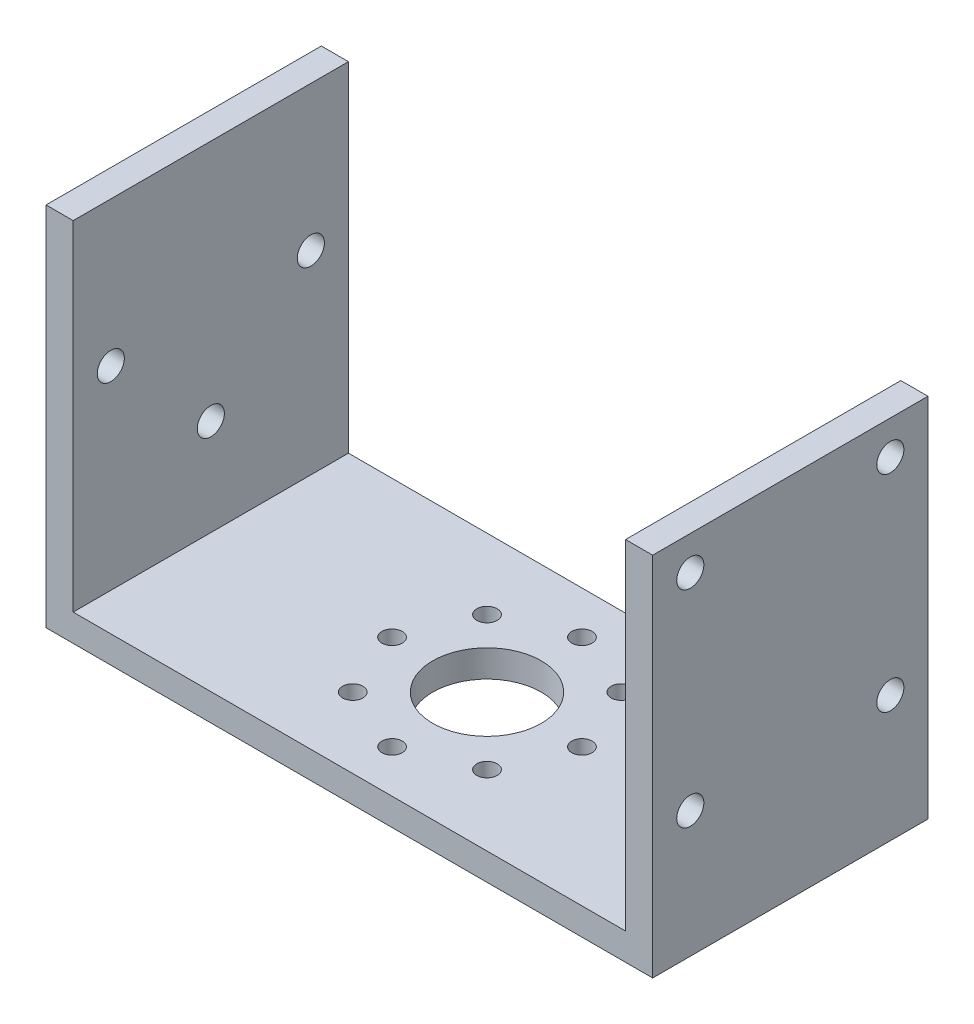
ISO-10303-21;
HEADER;
FILE_DESCRIPTION(('STEP AP214'),'2;1');
FILE_NAME('part.step','',(''),(''),'','','');
FILE_SCHEMA(('AUTOMOTIVE_DESIGN { 1 0 10303 214 1 1 1 1 }'));
ENDSEC;
DATA;
#1=APPLICATION_CONTEXT('core data for automotive mechanical design processes');
#2=APPLICATION_PROTOCOL_DEFINITION('international standard','automotive_design',2000,#1);
#3=PRODUCT_CONTEXT('',#1,'mechanical');
#4=PRODUCT('Part','Part','',(#3));
#5=PRODUCT_RELATED_PRODUCT_CATEGORY('part','',(#4));
#6=PRODUCT_DEFINITION_FORMATION('','',#4);
#7=PRODUCT_DEFINITION_CONTEXT('part definition',#1,'design');
#8=PRODUCT_DEFINITION('design','',#6,#7);
#9=PRODUCT_DEFINITION_SHAPE('','',#8);
#10=(LENGTH_UNIT() NAMED_UNIT(*) SI_UNIT(.MILLI.,.METRE.));
#11=(NAMED_UNIT(*) PLANE_ANGLE_UNIT() SI_UNIT($,.RADIAN.));
#12=(NAMED_UNIT(*) SI_UNIT($,.STERADIAN.) SOLID_ANGLE_UNIT());
#13=UNCERTAINTY_MEASURE_WITH_UNIT(LENGTH_MEASURE(1.E-05),#10,'distance_accuracy_value','');
#14=(GEOMETRIC_REPRESENTATION_CONTEXT(3) GLOBAL_UNCERTAINTY_ASSIGNED_CONTEXT((#13)) GLOBAL_UNIT_ASSIGNED_CONTEXT((#10,
#11,#12)) REPRESENTATION_CONTEXT('',''));
#15=CARTESIAN_POINT('',(0.,0.,0.));
#16=DIRECTION('',(0.,0.,1.));
#17=DIRECTION('',(1.,0.,0.));
#18=AXIS2_PLACEMENT_3D('',#15,#16,#17);
#19=CARTESIAN_POINT('',(0.,2.,0.));
#20=DIRECTION('',(0.,-1.,0.));
#21=DIRECTION('',(0.,0.,-1.));
#22=AXIS2_PLACEMENT_3D('',#19,#20,#21);
#23=PLANE('',#22);
#24=CARTESIAN_POINT('',(15.365,2.,-10.15));
#25=DIRECTION('',(0.,-1.,0.));
#26=DIRECTION('',(0.,0.,-1.));
#27=AXIS2_PLACEMENT_3D('',#24,#25,#26);
#28=CIRCLE('',#27,0.750000000000002);
#29=CARTESIAN_POINT('',(15.365,2.,-10.9));
#30=VERTEX_POINT('',#29);
#31=EDGE_CURVE('E490',#30,#30,#28,.F.);
#32=ORIENTED_EDGE('',*,*,#31,.F.);
#33=EDGE_LOOP('',(#32));
#34=FACE_BOUND('',#33,.T.);
#35=CARTESIAN_POINT('',(17.4152525316942,2.,-5.20025253169417));
#36=DIRECTION('',(0.,-1.,0.));
#37=DIRECTION('',(0.,0.,-1.));
#38=AXIS2_PLACEMENT_3D('',#35,#36,#37);
#39=CIRCLE('',#38,0.750000000000006);
#40=CARTESIAN_POINT('',(17.4152525316942,2.,-5.95025253169417));
#41=VERTEX_POINT('',#40);
#42=EDGE_CURVE('E491',#41,#41,#39,.F.);
#43=ORIENTED_EDGE('',*,*,#42,.F.);
#44=EDGE_LOOP('',(#43));
#45=FACE_BOUND('',#44,.T.);
#46=CARTESIAN_POINT('',(22.365,2.,-3.15));
#47=DIRECTION('',(0.,-1.,0.));
#48=DIRECTION('',(0.,0.,-1.));
#49=AXIS2_PLACEMENT_3D('',#46,#47,#48);
#50=CIRCLE('',#49,0.750000000000002);
#51=CARTESIAN_POINT('',(22.365,2.,-3.9));
#52=VERTEX_POINT('',#51);
#53=EDGE_CURVE('E498',#52,#52,#50,.F.);
#54=ORIENTED_EDGE('',*,*,#53,.F.);
#55=EDGE_LOOP('',(#54));
#56=FACE_BOUND('',#55,.T.);
#57=CARTESIAN_POINT('',(27.3147474683058,2.,-5.20025253169417));
#58=DIRECTION('',(0.,-1.,0.));
#59=DIRECTION('',(0.,0.,-1.));
#60=AXIS2_PLACEMENT_3D('',#57,#58,#59);
#61=CIRCLE('',#60,0.750000000000002);
#62=CARTESIAN_POINT('',(27.3147474683058,2.,-5.95025253169417));
#63=VERTEX_POINT('',#62);
#64=EDGE_CURVE('E504',#63,#63,#61,.F.);
#65=ORIENTED_EDGE('',*,*,#64,.F.);
#66=EDGE_LOOP('',(#65));
#67=FACE_BOUND('',#66,.T.);
#68=CARTESIAN_POINT('',(29.365,2.,-10.15));
#69=DIRECTION('',(0.,-1.,0.));
#70=DIRECTION('',(0.,0.,-1.));
#71=AXIS2_PLACEMENT_3D('',#68,#69,#70);
#72=CIRCLE('',#71,0.750000000000002);
#73=CARTESIAN_POINT('',(29.365,2.,-10.9));
#74=VERTEX_POINT('',#73);
#75=EDGE_CURVE('E510',#74,#74,#72,.F.);
#76=ORIENTED_EDGE('',*,*,#75,.F.);
#77=EDGE_LOOP('',(#76));
#78=FACE_BOUND('',#77,.T.);
#79=CARTESIAN_POINT('',(27.3147474683058,2.,-15.0997474683058));
#80=DIRECTION('',(0.,-1.,0.));
#81=DIRECTION('',(0.,0.,-1.));
#82=AXIS2_PLACEMENT_3D('',#79,#80,#81);
#83=CIRCLE('',#82,0.750000000000002);
#84=CARTESIAN_POINT('',(27.3147474683058,2.,-15.8497474683058));
#85=VERTEX_POINT('',#84);
#86=EDGE_CURVE('E516',#85,#85,#83,.F.);
#87=ORIENTED_EDGE('',*,*,#86,.F.);
#88=EDGE_LOOP('',(#87));
#89=FACE_BOUND('',#88,.T.);
#90=CARTESIAN_POINT('',(22.365,2.,-17.15));
#91=DIRECTION('',(0.,-1.,0.));
#92=DIRECTION('',(0.,0.,-1.));
#93=AXIS2_PLACEMENT_3D('',#90,#91,#92);
#94=CIRCLE('',#93,0.750000000000005);
#95=CARTESIAN_POINT('',(22.365,2.,-17.9));
#96=VERTEX_POINT('',#95);
#97=EDGE_CURVE('E522',#96,#96,#94,.F.);
#98=ORIENTED_EDGE('',*,*,#97,.F.);
#99=EDGE_LOOP('',(#98));
#100=FACE_BOUND('',#99,.T.);
#101=CARTESIAN_POINT('',(17.4152525316942,2.,-15.0997474683058));
#102=DIRECTION('',(0.,-1.,0.));
#103=DIRECTION('',(0.,0.,-1.));
#104=AXIS2_PLACEMENT_3D('',#101,#102,#103);
#105=CIRCLE('',#104,0.750000000000005);
#106=CARTESIAN_POINT('',(17.4152525316942,2.,-15.8497474683058));
#107=VERTEX_POINT('',#106);
#108=EDGE_CURVE('E528',#107,#107,#105,.F.);
#109=ORIENTED_EDGE('',*,*,#108,.F.);
#110=EDGE_LOOP('',(#109));
#111=FACE_BOUND('',#110,.T.);
#112=CARTESIAN_POINT('',(22.365,2.,-10.15));
#113=DIRECTION('',(0.,-1.,0.));
#114=DIRECTION('',(0.,0.,-1.));
#115=AXIS2_PLACEMENT_3D('',#112,#113,#114);
#116=CIRCLE('',#115,4.);
#117=CARTESIAN_POINT('',(22.365,2.,-14.15));
#118=VERTEX_POINT('',#117);
#119=EDGE_CURVE('E124',#118,#118,#116,.F.);
#120=ORIENTED_EDGE('',*,*,#119,.F.);
#121=EDGE_LOOP('',(#120));
#122=FACE_BOUND('',#121,.T.);
#123=DIRECTION('',(0.,0.,1.));
#124=VECTOR('',#123,1.);
#125=CARTESIAN_POINT('',(42.73,2.,-20.3));
#126=LINE('',#125,#124);
#127=CARTESIAN_POINT('',(42.73,2.,-20.3));
#128=VERTEX_POINT('',#127);
#129=CARTESIAN_POINT('',(42.73,2.,0.));
#130=VERTEX_POINT('',#129);
#131=EDGE_CURVE('E122',#128,#130,#126,.T.);
#132=ORIENTED_EDGE('',*,*,#131,.F.);
#133=DIRECTION('',(-1.,0.,0.));
#134=VECTOR('',#133,1.);
#135=CARTESIAN_POINT('',(0.,2.,-20.3));
#136=LINE('',#135,#134);
#137=CARTESIAN_POINT('',(2.,2.,-20.3));
#138=VERTEX_POINT('',#137);
#139=EDGE_CURVE('E154',#128,#138,#136,.T.);
#140=ORIENTED_EDGE('',*,*,#139,.T.);
#141=DIRECTION('',(0.,0.,-1.));
#142=VECTOR('',#141,1.);
#143=CARTESIAN_POINT('',(2.,2.,-20.3));
#144=LINE('',#143,#142);
#145=CARTESIAN_POINT('',(2.,2.,0.));
#146=VERTEX_POINT('',#145);
#147=EDGE_CURVE('E53',#146,#138,#144,.T.);
#148=ORIENTED_EDGE('',*,*,#147,.F.);
#149=DIRECTION('',(1.,0.,0.));
#150=VECTOR('',#149,1.);
#151=CARTESIAN_POINT('',(0.,2.,0.));
#152=LINE('',#151,#150);
#153=EDGE_CURVE('E48',#146,#130,#152,.T.);
#154=ORIENTED_EDGE('',*,*,#153,.T.);
#155=EDGE_LOOP('',(#132,#140,#148,#154));
#156=FACE_BOUND('',#155,.T.);
#157=ADVANCED_FACE('F33',(#34,#45,#56,#67,#78,#89,#100,#111,#122,#156),#23,.F.);
#158=CARTESIAN_POINT('',(0.,2.,0.));
#159=DIRECTION('',(1.,0.,0.));
#160=DIRECTION('',(0.,0.,-1.));
#161=AXIS2_PLACEMENT_3D('',#158,#159,#160);
#162=PLANE('',#161);
#163=CARTESIAN_POINT('',(0.,9.12,-10.15));
#164=DIRECTION('',(1.,0.,0.));
#165=DIRECTION('',(0.,0.,-1.));
#166=AXIS2_PLACEMENT_3D('',#163,#164,#165);
#167=CIRCLE('',#166,0.999999999999999);
#168=CARTESIAN_POINT('',(0.,9.12,-11.15));
#169=VERTEX_POINT('',#168);
#170=EDGE_CURVE('E472',#169,#169,#167,.F.);
#171=ORIENTED_EDGE('',*,*,#170,.F.);
#172=EDGE_LOOP('',(#171));
#173=FACE_BOUND('',#172,.T.);
#174=CARTESIAN_POINT('',(0.,16.33,-17.525));
#175=DIRECTION('',(1.,0.,0.));
#176=DIRECTION('',(0.,0.,-1.));
#177=AXIS2_PLACEMENT_3D('',#174,#175,#176);
#178=CIRCLE('',#177,1.);
#179=CARTESIAN_POINT('',(0.,16.33,-18.525));
#180=VERTEX_POINT('',#179);
#181=EDGE_CURVE('E473',#180,#180,#178,.F.);
#182=ORIENTED_EDGE('',*,*,#181,.F.);
#183=EDGE_LOOP('',(#182));
#184=FACE_BOUND('',#183,.T.);
#185=CARTESIAN_POINT('',(0.,16.33,-2.775));
#186=DIRECTION('',(1.,0.,0.));
#187=DIRECTION('',(0.,0.,-1.));
#188=AXIS2_PLACEMENT_3D('',#185,#186,#187);
#189=CIRCLE('',#188,1.);
#190=CARTESIAN_POINT('',(0.,16.33,-3.775));
#191=VERTEX_POINT('',#190);
#192=EDGE_CURVE('E480',#191,#191,#189,.F.);
#193=ORIENTED_EDGE('',*,*,#192,.F.);
#194=EDGE_LOOP('',(#193));
#195=FACE_BOUND('',#194,.T.);
#196=DIRECTION('',(0.,0.,1.));
#197=VECTOR('',#196,1.);
#198=CARTESIAN_POINT('',(0.,0.,0.));
#199=LINE('',#198,#197);
#200=CARTESIAN_POINT('',(0.,0.,-20.3));
#201=VERTEX_POINT('',#200);
#202=CARTESIAN_POINT('',(0.,0.,0.));
#203=VERTEX_POINT('',#202);
#204=EDGE_CURVE('E152',#201,#203,#199,.T.);
#205=ORIENTED_EDGE('',*,*,#204,.T.);
#206=DIRECTION('',(0.,-1.,0.));
#207=VECTOR('',#206,1.);
#208=CARTESIAN_POINT('',(0.,2.,0.));
#209=LINE('',#208,#207);
#210=CARTESIAN_POINT('',(0.,27.,0.));
#211=VERTEX_POINT('',#210);
#212=EDGE_CURVE('E11',#211,#203,#209,.T.);
#213=ORIENTED_EDGE('',*,*,#212,.F.);
#214=DIRECTION('',(0.,0.,1.));
#215=VECTOR('',#214,1.);
#216=CARTESIAN_POINT('',(0.,27.,-20.3));
#217=LINE('',#216,#215);
#218=CARTESIAN_POINT('',(0.,27.,-20.3));
#219=VERTEX_POINT('',#218);
#220=EDGE_CURVE('E135',#219,#211,#217,.T.);
#221=ORIENTED_EDGE('',*,*,#220,.F.);
#222=DIRECTION('',(0.,-1.,0.));
#223=VECTOR('',#222,1.);
#224=CARTESIAN_POINT('',(0.,2.,-20.3));
#225=LINE('',#224,#223);
#226=EDGE_CURVE('E107',#219,#201,#225,.T.);
#227=ORIENTED_EDGE('',*,*,#226,.T.);
#228=EDGE_LOOP('',(#205,#213,#221,#227));
#229=FACE_BOUND('',#228,.T.);
#230=ADVANCED_FACE('F35',(#173,#184,#195,#229),#162,.F.);
#231=CARTESIAN_POINT('',(0.,2.,0.));
#232=DIRECTION('',(0.,0.,-1.));
#233=DIRECTION('',(-1.,0.,0.));
#234=AXIS2_PLACEMENT_3D('',#231,#232,#233);
#235=PLANE('',#234);
#236=DIRECTION('',(1.,0.,0.));
#237=VECTOR('',#236,1.);
#238=CARTESIAN_POINT('',(0.,0.,0.));
#239=LINE('',#238,#237);
#240=CARTESIAN_POINT('',(44.73,0.,0.));
#241=VERTEX_POINT('',#240);
#242=EDGE_CURVE('E159',#203,#241,#239,.T.);
#243=ORIENTED_EDGE('',*,*,#242,.T.);
#244=DIRECTION('',(0.,-1.,0.));
#245=VECTOR('',#244,1.);
#246=CARTESIAN_POINT('',(44.73,2.,0.));
#247=LINE('',#246,#245);
#248=CARTESIAN_POINT('',(44.73,27.,0.));
#249=VERTEX_POINT('',#248);
#250=EDGE_CURVE('E41',#249,#241,#247,.T.);
#251=ORIENTED_EDGE('',*,*,#250,.F.);
#252=DIRECTION('',(1.,0.,0.));
#253=VECTOR('',#252,1.);
#254=CARTESIAN_POINT('',(44.73,27.,0.));
#255=LINE('',#254,#253);
#256=CARTESIAN_POINT('',(42.73,27.,0.));
#257=VERTEX_POINT('',#256);
#258=EDGE_CURVE('E121',#257,#249,#255,.T.);
#259=ORIENTED_EDGE('',*,*,#258,.F.);
#260=DIRECTION('',(0.,-1.,0.));
#261=VECTOR('',#260,1.);
#262=CARTESIAN_POINT('',(42.73,27.,0.));
#263=LINE('',#262,#261);
#264=EDGE_CURVE('E130',#257,#130,#263,.T.);
#265=ORIENTED_EDGE('',*,*,#264,.T.);
#266=ORIENTED_EDGE('',*,*,#153,.F.);
#267=DIRECTION('',(0.,-1.,0.));
#268=VECTOR('',#267,1.);
#269=CARTESIAN_POINT('',(2.,27.,0.));
#270=LINE('',#269,#268);
#271=CARTESIAN_POINT('',(2.,27.,0.));
#272=VERTEX_POINT('',#271);
#273=EDGE_CURVE('E149',#272,#146,#270,.T.);
#274=ORIENTED_EDGE('',*,*,#273,.F.);
#275=DIRECTION('',(1.,0.,0.));
#276=VECTOR('',#275,1.);
#277=CARTESIAN_POINT('',(0.,27.,0.));
#278=LINE('',#277,#276);
#279=EDGE_CURVE('E138',#211,#272,#278,.T.);
#280=ORIENTED_EDGE('',*,*,#279,.F.);
#281=ORIENTED_EDGE('',*,*,#212,.T.);
#282=EDGE_LOOP('',(#243,#251,#259,#265,#266,#274,#280,#281));
#283=FACE_BOUND('',#282,.T.);
#284=ADVANCED_FACE('F179',(#283),#235,.F.);
#285=CARTESIAN_POINT('',(44.73,2.,0.));
#286=DIRECTION('',(-1.,0.,0.));
#287=DIRECTION('',(0.,0.,1.));
#288=AXIS2_PLACEMENT_3D('',#285,#286,#287);
#289=PLANE('',#288);
#290=CARTESIAN_POINT('',(44.73,24.5,-2.775));
#291=DIRECTION('',(-1.,0.,0.));
#292=DIRECTION('',(0.,0.,1.));
#293=AXIS2_PLACEMENT_3D('',#290,#291,#292);
#294=CIRCLE('',#293,1.);
#295=CARTESIAN_POINT('',(44.73,24.5,-1.775));
#296=VERTEX_POINT('',#295);
#297=EDGE_CURVE('E450',#296,#296,#294,.F.);
#298=ORIENTED_EDGE('',*,*,#297,.F.);
#299=EDGE_LOOP('',(#298));
#300=FACE_BOUND('',#299,.T.);
#301=CARTESIAN_POINT('',(44.73,24.5,-17.525));
#302=DIRECTION('',(-1.,0.,0.));
#303=DIRECTION('',(0.,0.,1.));
#304=AXIS2_PLACEMENT_3D('',#301,#302,#303);
#305=CIRCLE('',#304,1.);
#306=CARTESIAN_POINT('',(44.73,24.5,-16.525));
#307=VERTEX_POINT('',#306);
#308=EDGE_CURVE('E458',#307,#307,#305,.F.);
#309=ORIENTED_EDGE('',*,*,#308,.F.);
#310=EDGE_LOOP('',(#309));
#311=FACE_BOUND('',#310,.T.);
#312=CARTESIAN_POINT('',(44.73,9.3,-17.525));
#313=DIRECTION('',(-1.,0.,0.));
#314=DIRECTION('',(0.,0.,1.));
#315=AXIS2_PLACEMENT_3D('',#312,#313,#314);
#316=CIRCLE('',#315,1.);
#317=CARTESIAN_POINT('',(44.73,9.3,-16.525));
#318=VERTEX_POINT('',#317);
#319=EDGE_CURVE('E465',#318,#318,#316,.F.);
#320=ORIENTED_EDGE('',*,*,#319,.F.);
#321=EDGE_LOOP('',(#320));
#322=FACE_BOUND('',#321,.T.);
#323=CARTESIAN_POINT('',(44.73,9.3,-2.775));
#324=DIRECTION('',(-1.,0.,0.));
#325=DIRECTION('',(0.,0.,1.));
#326=AXIS2_PLACEMENT_3D('',#323,#324,#325);
#327=CIRCLE('',#326,1.);
#328=CARTESIAN_POINT('',(44.73,9.3,-1.775));
#329=VERTEX_POINT('',#328);
#330=EDGE_CURVE('E464',#329,#329,#327,.F.);
#331=ORIENTED_EDGE('',*,*,#330,.F.);
#332=EDGE_LOOP('',(#331));
#333=FACE_BOUND('',#332,.T.);
#334=DIRECTION('',(0.,0.,-1.));
#335=VECTOR('',#334,1.);
#336=CARTESIAN_POINT('',(44.73,0.,0.));
#337=LINE('',#336,#335);
#338=CARTESIAN_POINT('',(44.73,0.,-20.3));
#339=VERTEX_POINT('',#338);
#340=EDGE_CURVE('E104',#241,#339,#337,.T.);
#341=ORIENTED_EDGE('',*,*,#340,.T.);
#342=DIRECTION('',(0.,-1.,0.));
#343=VECTOR('',#342,1.);
#344=CARTESIAN_POINT('',(44.73,2.,-20.3));
#345=LINE('',#344,#343);
#346=CARTESIAN_POINT('',(44.73,27.,-20.3));
#347=VERTEX_POINT('',#346);
#348=EDGE_CURVE('E97',#347,#339,#345,.T.);
#349=ORIENTED_EDGE('',*,*,#348,.F.);
#350=DIRECTION('',(0.,0.,-1.));
#351=VECTOR('',#350,1.);
#352=CARTESIAN_POINT('',(44.73,27.,-20.3));
#353=LINE('',#352,#351);
#354=EDGE_CURVE('E102',#249,#347,#353,.T.);
#355=ORIENTED_EDGE('',*,*,#354,.F.);
#356=ORIENTED_EDGE('',*,*,#250,.T.);
#357=EDGE_LOOP('',(#341,#349,#355,#356));
#358=FACE_BOUND('',#357,.T.);
#359=ADVANCED_FACE('F99',(#300,#311,#322,#333,#358),#289,.F.);
#360=CARTESIAN_POINT('',(0.,2.,-20.3));
#361=DIRECTION('',(0.,0.,1.));
#362=DIRECTION('',(1.,0.,0.));
#363=AXIS2_PLACEMENT_3D('',#360,#361,#362);
#364=PLANE('',#363);
#365=DIRECTION('',(-1.,0.,0.));
#366=VECTOR('',#365,1.);
#367=CARTESIAN_POINT('',(0.,0.,-20.3));
#368=LINE('',#367,#366);
#369=EDGE_CURVE('E155',#339,#201,#368,.T.);
#370=ORIENTED_EDGE('',*,*,#369,.T.);
#371=ORIENTED_EDGE('',*,*,#226,.F.);
#372=DIRECTION('',(-1.,0.,0.));
#373=VECTOR('',#372,1.);
#374=CARTESIAN_POINT('',(0.,27.,-20.3));
#375=LINE('',#374,#373);
#376=CARTESIAN_POINT('',(2.,27.,-20.3));
#377=VERTEX_POINT('',#376);
#378=EDGE_CURVE('E142',#377,#219,#375,.T.);
#379=ORIENTED_EDGE('',*,*,#378,.F.);
#380=DIRECTION('',(0.,-1.,0.));
#381=VECTOR('',#380,1.);
#382=CARTESIAN_POINT('',(2.,27.,-20.3));
#383=LINE('',#382,#381);
#384=EDGE_CURVE('E145',#377,#138,#383,.T.);
#385=ORIENTED_EDGE('',*,*,#384,.T.);
#386=ORIENTED_EDGE('',*,*,#139,.F.);
#387=DIRECTION('',(0.,-1.,0.));
#388=VECTOR('',#387,1.);
#389=CARTESIAN_POINT('',(42.73,27.,-20.3));
#390=LINE('',#389,#388);
#391=CARTESIAN_POINT('',(42.73,27.,-20.3));
#392=VERTEX_POINT('',#391);
#393=EDGE_CURVE('E113',#392,#128,#390,.T.);
#394=ORIENTED_EDGE('',*,*,#393,.F.);
#395=DIRECTION('',(-1.,0.,0.));
#396=VECTOR('',#395,1.);
#397=CARTESIAN_POINT('',(44.73,27.,-20.3));
#398=LINE('',#397,#396);
#399=EDGE_CURVE('E110',#347,#392,#398,.T.);
#400=ORIENTED_EDGE('',*,*,#399,.F.);
#401=ORIENTED_EDGE('',*,*,#348,.T.);
#402=EDGE_LOOP('',(#370,#371,#379,#385,#386,#394,#400,#401));
#403=FACE_BOUND('',#402,.T.);
#404=ADVANCED_FACE('F111',(#403),#364,.F.);
#405=CARTESIAN_POINT('',(0.,0.,0.));
#406=DIRECTION('',(0.,-1.,0.));
#407=DIRECTION('',(0.,0.,-1.));
#408=AXIS2_PLACEMENT_3D('',#405,#406,#407);
#409=PLANE('',#408);
#410=CARTESIAN_POINT('',(15.365,0.,-10.15));
#411=DIRECTION('',(0.,-1.,0.));
#412=DIRECTION('',(0.,0.,-1.));
#413=AXIS2_PLACEMENT_3D('',#410,#411,#412);
#414=CIRCLE('',#413,0.750000000000002);
#415=CARTESIAN_POINT('',(15.365,0.,-10.9));
#416=VERTEX_POINT('',#415);
#417=EDGE_CURVE('E487',#416,#416,#414,.T.);
#418=ORIENTED_EDGE('',*,*,#417,.F.);
#419=EDGE_LOOP('',(#418));
#420=FACE_BOUND('',#419,.T.);
#421=CARTESIAN_POINT('',(17.4152525316942,0.,-5.20025253169417));
#422=DIRECTION('',(0.,-1.,0.));
#423=DIRECTION('',(0.,0.,-1.));
#424=AXIS2_PLACEMENT_3D('',#421,#422,#423);
#425=CIRCLE('',#424,0.750000000000006);
#426=CARTESIAN_POINT('',(17.4152525316942,0.,-5.95025253169417));
#427=VERTEX_POINT('',#426);
#428=EDGE_CURVE('E495',#427,#427,#425,.T.);
#429=ORIENTED_EDGE('',*,*,#428,.F.);
#430=EDGE_LOOP('',(#429));
#431=FACE_BOUND('',#430,.T.);
#432=CARTESIAN_POINT('',(22.365,0.,-3.15));
#433=DIRECTION('',(0.,-1.,0.));
#434=DIRECTION('',(0.,0.,-1.));
#435=AXIS2_PLACEMENT_3D('',#432,#433,#434);
#436=CIRCLE('',#435,0.750000000000002);
#437=CARTESIAN_POINT('',(22.365,0.,-3.9));
#438=VERTEX_POINT('',#437);
#439=EDGE_CURVE('E501',#438,#438,#436,.T.);
#440=ORIENTED_EDGE('',*,*,#439,.F.);
#441=EDGE_LOOP('',(#440));
#442=FACE_BOUND('',#441,.T.);
#443=CARTESIAN_POINT('',(27.3147474683058,0.,-5.20025253169417));
#444=DIRECTION('',(0.,-1.,0.));
#445=DIRECTION('',(0.,0.,-1.));
#446=AXIS2_PLACEMENT_3D('',#443,#444,#445);
#447=CIRCLE('',#446,0.750000000000002);
#448=CARTESIAN_POINT('',(27.3147474683058,0.,-5.95025253169417));
#449=VERTEX_POINT('',#448);
#450=EDGE_CURVE('E507',#449,#449,#447,.T.);
#451=ORIENTED_EDGE('',*,*,#450,.F.);
#452=EDGE_LOOP('',(#451));
#453=FACE_BOUND('',#452,.T.);
#454=CARTESIAN_POINT('',(29.365,0.,-10.15));
#455=DIRECTION('',(0.,-1.,0.));
#456=DIRECTION('',(0.,0.,-1.));
#457=AXIS2_PLACEMENT_3D('',#454,#455,#456);
#458=CIRCLE('',#457,0.750000000000002);
#459=CARTESIAN_POINT('',(29.365,0.,-10.9));
#460=VERTEX_POINT('',#459);
#461=EDGE_CURVE('E513',#460,#460,#458,.T.);
#462=ORIENTED_EDGE('',*,*,#461,.F.);
#463=EDGE_LOOP('',(#462));
#464=FACE_BOUND('',#463,.T.);
#465=CARTESIAN_POINT('',(27.3147474683058,0.,-15.0997474683058));
#466=DIRECTION('',(0.,-1.,0.));
#467=DIRECTION('',(0.,0.,-1.));
#468=AXIS2_PLACEMENT_3D('',#465,#466,#467);
#469=CIRCLE('',#468,0.750000000000002);
#470=CARTESIAN_POINT('',(27.3147474683058,0.,-15.8497474683058));
#471=VERTEX_POINT('',#470);
#472=EDGE_CURVE('E519',#471,#471,#469,.T.);
#473=ORIENTED_EDGE('',*,*,#472,.F.);
#474=EDGE_LOOP('',(#473));
#475=FACE_BOUND('',#474,.T.);
#476=CARTESIAN_POINT('',(22.365,0.,-17.15));
#477=DIRECTION('',(0.,-1.,0.));
#478=DIRECTION('',(0.,0.,-1.));
#479=AXIS2_PLACEMENT_3D('',#476,#477,#478);
#480=CIRCLE('',#479,0.750000000000005);
#481=CARTESIAN_POINT('',(22.365,0.,-17.9));
#482=VERTEX_POINT('',#481);
#483=EDGE_CURVE('E525',#482,#482,#480,.T.);
#484=ORIENTED_EDGE('',*,*,#483,.F.);
#485=EDGE_LOOP('',(#484));
#486=FACE_BOUND('',#485,.T.);
#487=CARTESIAN_POINT('',(17.4152525316942,0.,-15.0997474683058));
#488=DIRECTION('',(0.,-1.,0.));
#489=DIRECTION('',(0.,0.,-1.));
#490=AXIS2_PLACEMENT_3D('',#487,#488,#489);
#491=CIRCLE('',#490,0.750000000000005);
#492=CARTESIAN_POINT('',(17.4152525316942,0.,-15.8497474683058));
#493=VERTEX_POINT('',#492);
#494=EDGE_CURVE('E476',#493,#493,#491,.T.);
#495=ORIENTED_EDGE('',*,*,#494,.F.);
#496=EDGE_LOOP('',(#495));
#497=FACE_BOUND('',#496,.T.);
#498=CARTESIAN_POINT('',(22.365,0.,-10.15));
#499=DIRECTION('',(0.,-1.,0.));
#500=DIRECTION('',(0.,0.,-1.));
#501=AXIS2_PLACEMENT_3D('',#498,#499,#500);
#502=CIRCLE('',#501,4.);
#503=CARTESIAN_POINT('',(22.365,0.,-14.15));
#504=VERTEX_POINT('',#503);
#505=EDGE_CURVE('E494',#504,#504,#502,.T.);
#506=ORIENTED_EDGE('',*,*,#505,.F.);
#507=EDGE_LOOP('',(#506));
#508=FACE_BOUND('',#507,.T.);
#509=ORIENTED_EDGE('',*,*,#204,.F.);
#510=ORIENTED_EDGE('',*,*,#369,.F.);
#511=ORIENTED_EDGE('',*,*,#340,.F.);
#512=ORIENTED_EDGE('',*,*,#242,.F.);
#513=EDGE_LOOP('',(#509,#510,#511,#512));
#514=FACE_BOUND('',#513,.T.);
#515=ADVANCED_FACE('F167',(#420,#431,#442,#453,#464,#475,#486,#497,#508,#514),#409,.T.);
#516=CARTESIAN_POINT('',(2.,27.,-20.3));
#517=DIRECTION('',(-1.,0.,0.));
#518=DIRECTION('',(0.,0.,1.));
#519=AXIS2_PLACEMENT_3D('',#516,#517,#518);
#520=PLANE('',#519);
#521=CARTESIAN_POINT('',(2.,9.12,-10.15));
#522=DIRECTION('',(1.,0.,0.));
#523=DIRECTION('',(0.,0.,-1.));
#524=AXIS2_PLACEMENT_3D('',#521,#522,#523);
#525=CIRCLE('',#524,0.999999999999999);
#526=CARTESIAN_POINT('',(2.,9.12,-11.15));
#527=VERTEX_POINT('',#526);
#528=EDGE_CURVE('E469',#527,#527,#525,.T.);
#529=ORIENTED_EDGE('',*,*,#528,.F.);
#530=EDGE_LOOP('',(#529));
#531=FACE_BOUND('',#530,.T.);
#532=CARTESIAN_POINT('',(2.,16.33,-17.525));
#533=DIRECTION('',(1.,0.,0.));
#534=DIRECTION('',(0.,0.,-1.));
#535=AXIS2_PLACEMENT_3D('',#532,#533,#534);
#536=CIRCLE('',#535,1.);
#537=CARTESIAN_POINT('',(2.,16.33,-18.525));
#538=VERTEX_POINT('',#537);
#539=EDGE_CURVE('E477',#538,#538,#536,.T.);
#540=ORIENTED_EDGE('',*,*,#539,.F.);
#541=EDGE_LOOP('',(#540));
#542=FACE_BOUND('',#541,.T.);
#543=CARTESIAN_POINT('',(2.,16.33,-2.775));
#544=DIRECTION('',(1.,0.,0.));
#545=DIRECTION('',(0.,0.,-1.));
#546=AXIS2_PLACEMENT_3D('',#543,#544,#545);
#547=CIRCLE('',#546,1.);
#548=CARTESIAN_POINT('',(2.,16.33,-3.775));
#549=VERTEX_POINT('',#548);
#550=EDGE_CURVE('E468',#549,#549,#547,.T.);
#551=ORIENTED_EDGE('',*,*,#550,.F.);
#552=EDGE_LOOP('',(#551));
#553=FACE_BOUND('',#552,.T.);
#554=ORIENTED_EDGE('',*,*,#147,.T.);
#555=ORIENTED_EDGE('',*,*,#384,.F.);
#556=DIRECTION('',(0.,0.,-1.));
#557=VECTOR('',#556,1.);
#558=CARTESIAN_POINT('',(2.,27.,-20.3));
#559=LINE('',#558,#557);
#560=EDGE_CURVE('E140',#272,#377,#559,.T.);
#561=ORIENTED_EDGE('',*,*,#560,.F.);
#562=ORIENTED_EDGE('',*,*,#273,.T.);
#563=EDGE_LOOP('',(#554,#555,#561,#562));
#564=FACE_BOUND('',#563,.T.);
#565=ADVANCED_FACE('F178',(#531,#542,#553,#564),#520,.F.);
#566=CARTESIAN_POINT('',(0.,27.,0.));
#567=DIRECTION('',(0.,1.,0.));
#568=DIRECTION('',(0.,0.,1.));
#569=AXIS2_PLACEMENT_3D('',#566,#567,#568);
#570=PLANE('',#569);
#571=ORIENTED_EDGE('',*,*,#220,.T.);
#572=ORIENTED_EDGE('',*,*,#279,.T.);
#573=ORIENTED_EDGE('',*,*,#560,.T.);
#574=ORIENTED_EDGE('',*,*,#378,.T.);
#575=EDGE_LOOP('',(#571,#572,#573,#574));
#576=FACE_BOUND('',#575,.T.);
#577=ADVANCED_FACE('F173',(#576),#570,.T.);
#578=CARTESIAN_POINT('',(42.73,27.,-20.3));
#579=DIRECTION('',(1.,0.,0.));
#580=DIRECTION('',(0.,0.,-1.));
#581=AXIS2_PLACEMENT_3D('',#578,#579,#580);
#582=PLANE('',#581);
#583=CARTESIAN_POINT('',(42.73,24.5,-2.775));
#584=DIRECTION('',(-1.,0.,0.));
#585=DIRECTION('',(0.,0.,1.));
#586=AXIS2_PLACEMENT_3D('',#583,#584,#585);
#587=CIRCLE('',#586,1.);
#588=CARTESIAN_POINT('',(42.73,24.5,-1.775));
#589=VERTEX_POINT('',#588);
#590=EDGE_CURVE('E453',#589,#589,#587,.T.);
#591=ORIENTED_EDGE('',*,*,#590,.F.);
#592=EDGE_LOOP('',(#591));
#593=FACE_BOUND('',#592,.T.);
#594=CARTESIAN_POINT('',(42.73,24.5,-17.525));
#595=DIRECTION('',(-1.,0.,0.));
#596=DIRECTION('',(0.,0.,1.));
#597=AXIS2_PLACEMENT_3D('',#594,#595,#596);
#598=CIRCLE('',#597,1.);
#599=CARTESIAN_POINT('',(42.73,24.5,-16.525));
#600=VERTEX_POINT('',#599);
#601=EDGE_CURVE('E455',#600,#600,#598,.T.);
#602=ORIENTED_EDGE('',*,*,#601,.F.);
#603=EDGE_LOOP('',(#602));
#604=FACE_BOUND('',#603,.T.);
#605=CARTESIAN_POINT('',(42.73,9.3,-17.525));
#606=DIRECTION('',(-1.,0.,0.));
#607=DIRECTION('',(0.,0.,1.));
#608=AXIS2_PLACEMENT_3D('',#605,#606,#607);
#609=CIRCLE('',#608,1.);
#610=CARTESIAN_POINT('',(42.73,9.3,-16.525));
#611=VERTEX_POINT('',#610);
#612=EDGE_CURVE('E596',#611,#611,#609,.T.);
#613=ORIENTED_EDGE('',*,*,#612,.F.);
#614=EDGE_LOOP('',(#613));
#615=FACE_BOUND('',#614,.T.);
#616=CARTESIAN_POINT('',(42.73,9.3,-2.775));
#617=DIRECTION('',(-1.,0.,0.));
#618=DIRECTION('',(0.,0.,1.));
#619=AXIS2_PLACEMENT_3D('',#616,#617,#618);
#620=CIRCLE('',#619,1.);
#621=CARTESIAN_POINT('',(42.73,9.3,-1.775));
#622=VERTEX_POINT('',#621);
#623=EDGE_CURVE('E461',#622,#622,#620,.T.);
#624=ORIENTED_EDGE('',*,*,#623,.F.);
#625=EDGE_LOOP('',(#624));
#626=FACE_BOUND('',#625,.T.);
#627=ORIENTED_EDGE('',*,*,#131,.T.);
#628=ORIENTED_EDGE('',*,*,#264,.F.);
#629=DIRECTION('',(0.,0.,1.));
#630=VECTOR('',#629,1.);
#631=CARTESIAN_POINT('',(42.73,27.,-20.3));
#632=LINE('',#631,#630);
#633=EDGE_CURVE('E116',#392,#257,#632,.T.);
#634=ORIENTED_EDGE('',*,*,#633,.F.);
#635=ORIENTED_EDGE('',*,*,#393,.T.);
#636=EDGE_LOOP('',(#627,#628,#634,#635));
#637=FACE_BOUND('',#636,.T.);
#638=ADVANCED_FACE('F182',(#593,#604,#615,#626,#637),#582,.F.);
#639=CARTESIAN_POINT('',(0.,27.,0.));
#640=DIRECTION('',(0.,-1.,0.));
#641=DIRECTION('',(0.,0.,-1.));
#642=AXIS2_PLACEMENT_3D('',#639,#640,#641);
#643=PLANE('',#642);
#644=ORIENTED_EDGE('',*,*,#354,.T.);
#645=ORIENTED_EDGE('',*,*,#399,.T.);
#646=ORIENTED_EDGE('',*,*,#633,.T.);
#647=ORIENTED_EDGE('',*,*,#258,.T.);
#648=EDGE_LOOP('',(#644,#645,#646,#647));
#649=FACE_BOUND('',#648,.T.);
#650=ADVANCED_FACE('F119',(#649),#643,.F.);
#651=CARTESIAN_POINT('',(22.365,13.3137084989848,-10.15));
#652=DIRECTION('',(0.,-1.,0.));
#653=DIRECTION('',(0.,0.,-1.));
#654=AXIS2_PLACEMENT_3D('',#651,#652,#653);
#655=CYLINDRICAL_SURFACE('',#654,4.);
#656=ORIENTED_EDGE('',*,*,#119,.T.);
#657=EDGE_LOOP('',(#656));
#658=FACE_BOUND('',#657,.T.);
#659=ORIENTED_EDGE('',*,*,#505,.T.);
#660=EDGE_LOOP('',(#659));
#661=FACE_BOUND('',#660,.T.);
#662=ADVANCED_FACE('F247',(#658,#661),#655,.F.);
#663=CARTESIAN_POINT('',(17.4152525316942,4.12132034355966,-15.0997474683058));
#664=DIRECTION('',(0.,-1.,0.));
#665=DIRECTION('',(0.,0.,-1.));
#666=AXIS2_PLACEMENT_3D('',#663,#664,#665);
#667=CYLINDRICAL_SURFACE('',#666,0.750000000000005);
#668=ORIENTED_EDGE('',*,*,#108,.T.);
#669=EDGE_LOOP('',(#668));
#670=FACE_BOUND('',#669,.T.);
#671=ORIENTED_EDGE('',*,*,#494,.T.);
#672=EDGE_LOOP('',(#671));
#673=FACE_BOUND('',#672,.T.);
#674=ADVANCED_FACE('F254',(#670,#673),#667,.F.);
#675=CARTESIAN_POINT('',(22.365,4.12132034355966,-17.15));
#676=DIRECTION('',(0.,-1.,0.));
#677=DIRECTION('',(0.,0.,-1.));
#678=AXIS2_PLACEMENT_3D('',#675,#676,#677);
#679=CYLINDRICAL_SURFACE('',#678,0.750000000000005);
#680=ORIENTED_EDGE('',*,*,#97,.T.);
#681=EDGE_LOOP('',(#680));
#682=FACE_BOUND('',#681,.T.);
#683=ORIENTED_EDGE('',*,*,#483,.T.);
#684=EDGE_LOOP('',(#683));
#685=FACE_BOUND('',#684,.T.);
#686=ADVANCED_FACE('F261',(#682,#685),#679,.F.);
#687=CARTESIAN_POINT('',(27.3147474683058,4.12132034355966,-15.0997474683058));
#688=DIRECTION('',(0.,-1.,0.));
#689=DIRECTION('',(0.,0.,-1.));
#690=AXIS2_PLACEMENT_3D('',#687,#688,#689);
#691=CYLINDRICAL_SURFACE('',#690,0.750000000000002);
#692=ORIENTED_EDGE('',*,*,#86,.T.);
#693=EDGE_LOOP('',(#692));
#694=FACE_BOUND('',#693,.T.);
#695=ORIENTED_EDGE('',*,*,#472,.T.);
#696=EDGE_LOOP('',(#695));
#697=FACE_BOUND('',#696,.T.);
#698=ADVANCED_FACE('F269',(#694,#697),#691,.F.);
#699=CARTESIAN_POINT('',(29.365,4.12132034355966,-10.15));
#700=DIRECTION('',(0.,-1.,0.));
#701=DIRECTION('',(0.,0.,-1.));
#702=AXIS2_PLACEMENT_3D('',#699,#700,#701);
#703=CYLINDRICAL_SURFACE('',#702,0.750000000000002);
#704=ORIENTED_EDGE('',*,*,#75,.T.);
#705=EDGE_LOOP('',(#704));
#706=FACE_BOUND('',#705,.T.);
#707=ORIENTED_EDGE('',*,*,#461,.T.);
#708=EDGE_LOOP('',(#707));
#709=FACE_BOUND('',#708,.T.);
#710=ADVANCED_FACE('F277',(#706,#709),#703,.F.);
#711=CARTESIAN_POINT('',(27.3147474683058,4.12132034355966,-5.20025253169417));
#712=DIRECTION('',(0.,-1.,0.));
#713=DIRECTION('',(0.,0.,-1.));
#714=AXIS2_PLACEMENT_3D('',#711,#712,#713);
#715=CYLINDRICAL_SURFACE('',#714,0.750000000000002);
#716=ORIENTED_EDGE('',*,*,#64,.T.);
#717=EDGE_LOOP('',(#716));
#718=FACE_BOUND('',#717,.T.);
#719=ORIENTED_EDGE('',*,*,#450,.T.);
#720=EDGE_LOOP('',(#719));
#721=FACE_BOUND('',#720,.T.);
#722=ADVANCED_FACE('F285',(#718,#721),#715,.F.);
#723=CARTESIAN_POINT('',(22.365,4.12132034355966,-3.15));
#724=DIRECTION('',(0.,-1.,0.));
#725=DIRECTION('',(0.,0.,-1.));
#726=AXIS2_PLACEMENT_3D('',#723,#724,#725);
#727=CYLINDRICAL_SURFACE('',#726,0.750000000000002);
#728=ORIENTED_EDGE('',*,*,#53,.T.);
#729=EDGE_LOOP('',(#728));
#730=FACE_BOUND('',#729,.T.);
#731=ORIENTED_EDGE('',*,*,#439,.T.);
#732=EDGE_LOOP('',(#731));
#733=FACE_BOUND('',#732,.T.);
#734=ADVANCED_FACE('F293',(#730,#733),#727,.F.);
#735=CARTESIAN_POINT('',(17.4152525316942,4.12132034355966,-5.20025253169417));
#736=DIRECTION('',(0.,-1.,0.));
#737=DIRECTION('',(0.,0.,-1.));
#738=AXIS2_PLACEMENT_3D('',#735,#736,#737);
#739=CYLINDRICAL_SURFACE('',#738,0.750000000000006);
#740=ORIENTED_EDGE('',*,*,#42,.T.);
#741=EDGE_LOOP('',(#740));
#742=FACE_BOUND('',#741,.T.);
#743=ORIENTED_EDGE('',*,*,#428,.T.);
#744=EDGE_LOOP('',(#743));
#745=FACE_BOUND('',#744,.T.);
#746=ADVANCED_FACE('F301',(#742,#745),#739,.F.);
#747=CARTESIAN_POINT('',(15.365,4.12132034355966,-10.15));
#748=DIRECTION('',(0.,-1.,0.));
#749=DIRECTION('',(0.,0.,-1.));
#750=AXIS2_PLACEMENT_3D('',#747,#748,#749);
#751=CYLINDRICAL_SURFACE('',#750,0.750000000000002);
#752=ORIENTED_EDGE('',*,*,#31,.T.);
#753=EDGE_LOOP('',(#752));
#754=FACE_BOUND('',#753,.T.);
#755=ORIENTED_EDGE('',*,*,#417,.T.);
#756=EDGE_LOOP('',(#755));
#757=FACE_BOUND('',#756,.T.);
#758=ADVANCED_FACE('F309',(#754,#757),#751,.F.);
#759=CARTESIAN_POINT('',(-2.82842712474619,16.33,-2.775));
#760=DIRECTION('',(1.,0.,0.));
#761=DIRECTION('',(0.,0.,-1.));
#762=AXIS2_PLACEMENT_3D('',#759,#760,#761);
#763=CYLINDRICAL_SURFACE('',#762,1.);
#764=ORIENTED_EDGE('',*,*,#192,.T.);
#765=EDGE_LOOP('',(#764));
#766=FACE_BOUND('',#765,.T.);
#767=ORIENTED_EDGE('',*,*,#550,.T.);
#768=EDGE_LOOP('',(#767));
#769=FACE_BOUND('',#768,.T.);
#770=ADVANCED_FACE('F317',(#766,#769),#763,.F.);
#771=CARTESIAN_POINT('',(-2.82842712474619,16.33,-17.525));
#772=DIRECTION('',(1.,0.,0.));
#773=DIRECTION('',(0.,0.,-1.));
#774=AXIS2_PLACEMENT_3D('',#771,#772,#773);
#775=CYLINDRICAL_SURFACE('',#774,1.);
#776=ORIENTED_EDGE('',*,*,#181,.T.);
#777=EDGE_LOOP('',(#776));
#778=FACE_BOUND('',#777,.T.);
#779=ORIENTED_EDGE('',*,*,#539,.T.);
#780=EDGE_LOOP('',(#779));
#781=FACE_BOUND('',#780,.T.);
#782=ADVANCED_FACE('F324',(#778,#781),#775,.F.);
#783=CARTESIAN_POINT('',(-2.82842712474619,9.12,-10.15));
#784=DIRECTION('',(1.,0.,0.));
#785=DIRECTION('',(0.,0.,-1.));
#786=AXIS2_PLACEMENT_3D('',#783,#784,#785);
#787=CYLINDRICAL_SURFACE('',#786,0.999999999999999);
#788=ORIENTED_EDGE('',*,*,#170,.T.);
#789=EDGE_LOOP('',(#788));
#790=FACE_BOUND('',#789,.T.);
#791=ORIENTED_EDGE('',*,*,#528,.T.);
#792=EDGE_LOOP('',(#791));
#793=FACE_BOUND('',#792,.T.);
#794=ADVANCED_FACE('F332',(#790,#793),#787,.F.);
#795=CARTESIAN_POINT('',(47.5584271247462,9.3,-2.775));
#796=DIRECTION('',(-1.,0.,0.));
#797=DIRECTION('',(0.,0.,1.));
#798=AXIS2_PLACEMENT_3D('',#795,#796,#797);
#799=CYLINDRICAL_SURFACE('',#798,1.);
#800=ORIENTED_EDGE('',*,*,#330,.T.);
#801=EDGE_LOOP('',(#800));
#802=FACE_BOUND('',#801,.T.);
#803=ORIENTED_EDGE('',*,*,#623,.T.);
#804=EDGE_LOOP('',(#803));
#805=FACE_BOUND('',#804,.T.);
#806=ADVANCED_FACE('F339',(#802,#805),#799,.F.);
#807=CARTESIAN_POINT('',(47.5584271247462,9.3,-17.525));
#808=DIRECTION('',(-1.,0.,0.));
#809=DIRECTION('',(0.,0.,1.));
#810=AXIS2_PLACEMENT_3D('',#807,#808,#809);
#811=CYLINDRICAL_SURFACE('',#810,1.);
#812=ORIENTED_EDGE('',*,*,#319,.T.);
#813=EDGE_LOOP('',(#812));
#814=FACE_BOUND('',#813,.T.);
#815=ORIENTED_EDGE('',*,*,#612,.T.);
#816=EDGE_LOOP('',(#815));
#817=FACE_BOUND('',#816,.T.);
#818=ADVANCED_FACE('F346',(#814,#817),#811,.F.);
#819=CARTESIAN_POINT('',(47.5584271247462,24.5,-17.525));
#820=DIRECTION('',(-1.,0.,0.));
#821=DIRECTION('',(0.,0.,1.));
#822=AXIS2_PLACEMENT_3D('',#819,#820,#821);
#823=CYLINDRICAL_SURFACE('',#822,1.);
#824=ORIENTED_EDGE('',*,*,#308,.T.);
#825=EDGE_LOOP('',(#824));
#826=FACE_BOUND('',#825,.T.);
#827=ORIENTED_EDGE('',*,*,#601,.T.);
#828=EDGE_LOOP('',(#827));
#829=FACE_BOUND('',#828,.T.);
#830=ADVANCED_FACE('F354',(#826,#829),#823,.F.);
#831=CARTESIAN_POINT('',(47.5584271247462,24.5,-2.775));
#832=DIRECTION('',(-1.,0.,0.));
#833=DIRECTION('',(0.,0.,1.));
#834=AXIS2_PLACEMENT_3D('',#831,#832,#833);
#835=CYLINDRICAL_SURFACE('',#834,1.);
#836=ORIENTED_EDGE('',*,*,#297,.T.);
#837=EDGE_LOOP('',(#836));
#838=FACE_BOUND('',#837,.T.);
#839=ORIENTED_EDGE('',*,*,#590,.T.);
#840=EDGE_LOOP('',(#839));
#841=FACE_BOUND('',#840,.T.);
#842=ADVANCED_FACE('F362',(#838,#841),#835,.F.);
#843=CLOSED_SHELL('',(#157,#230,#284,#359,#404,#515,#565,#577,#638,#650,#662,#674,#686,#698,
#710,#722,#734,#746,#758,#770,#782,#794,#806,#818,#830,#842));
#844=MANIFOLD_SOLID_BREP('B2',#843);
#845=ADVANCED_BREP_SHAPE_REPRESENTATION('',(#18,#844),#14);
#846=SHAPE_DEFINITION_REPRESENTATION(#9,#845);
ENDSEC;
END-ISO-10303-21;
